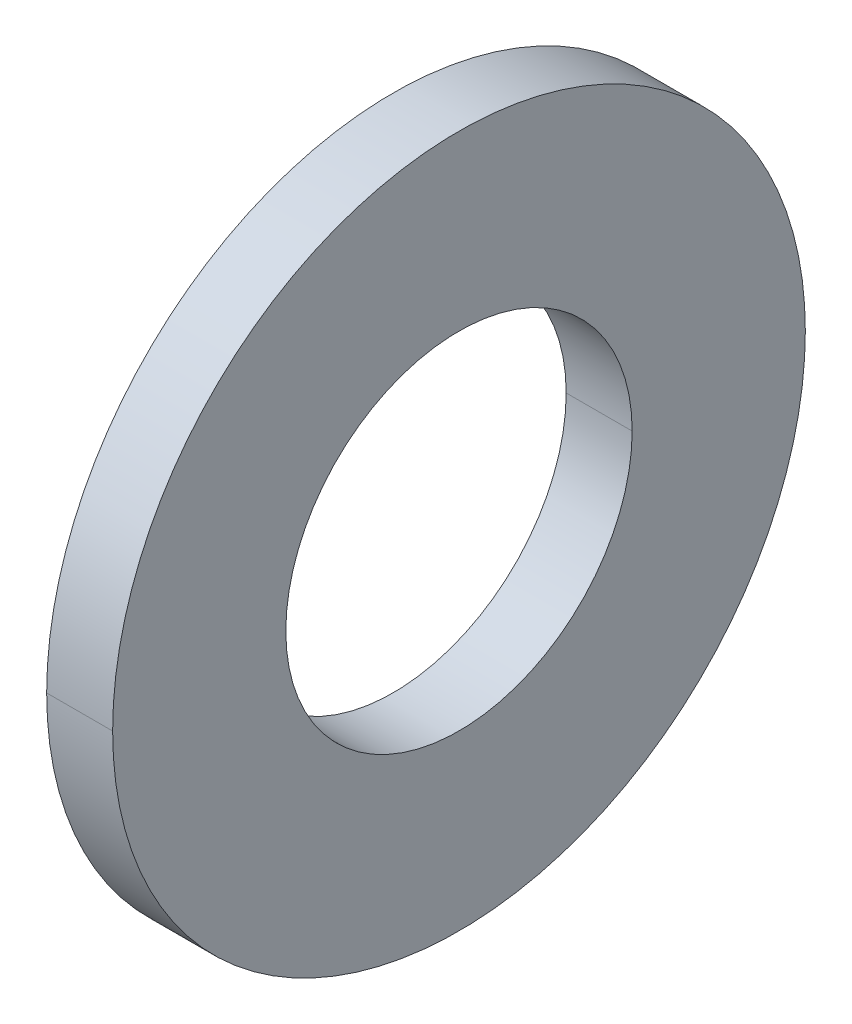
ISO-10303-21;
HEADER;
FILE_DESCRIPTION(('STEP AP214'),'2;1');
FILE_NAME('part.step','',(''),(''),'','','');
FILE_SCHEMA(('AUTOMOTIVE_DESIGN { 1 0 10303 214 1 1 1 1 }'));
ENDSEC;
DATA;
#1=APPLICATION_CONTEXT('core data for automotive mechanical design processes');
#2=APPLICATION_PROTOCOL_DEFINITION('international standard','automotive_design',2000,#1);
#3=PRODUCT_CONTEXT('',#1,'mechanical');
#4=PRODUCT('Part','Part','',(#3));
#5=PRODUCT_RELATED_PRODUCT_CATEGORY('part','',(#4));
#6=PRODUCT_DEFINITION_FORMATION('','',#4);
#7=PRODUCT_DEFINITION_CONTEXT('part definition',#1,'design');
#8=PRODUCT_DEFINITION('design','',#6,#7);
#9=PRODUCT_DEFINITION_SHAPE('','',#8);
#10=(LENGTH_UNIT() NAMED_UNIT(*) SI_UNIT(.MILLI.,.METRE.));
#11=(NAMED_UNIT(*) PLANE_ANGLE_UNIT() SI_UNIT($,.RADIAN.));
#12=(NAMED_UNIT(*) SI_UNIT($,.STERADIAN.) SOLID_ANGLE_UNIT());
#13=UNCERTAINTY_MEASURE_WITH_UNIT(LENGTH_MEASURE(1.E-05),#10,'distance_accuracy_value','');
#14=(GEOMETRIC_REPRESENTATION_CONTEXT(3) GLOBAL_UNCERTAINTY_ASSIGNED_CONTEXT((#13)) GLOBAL_UNIT_ASSIGNED_CONTEXT((#10,
#11,#12)) REPRESENTATION_CONTEXT('',''));
#15=CARTESIAN_POINT('',(0.,0.,0.));
#16=DIRECTION('',(0.,0.,1.));
#17=DIRECTION('',(1.,0.,0.));
#18=AXIS2_PLACEMENT_3D('',#15,#16,#17);
#19=CARTESIAN_POINT('',(1.,0.,0.));
#20=DIRECTION('',(-1.,0.,0.));
#21=DIRECTION('',(0.,1.,0.));
#22=AXIS2_PLACEMENT_3D('',#19,#20,#21);
#23=CYLINDRICAL_SURFACE('',#22,10.5);
#24=CARTESIAN_POINT('',(-1.,0.,0.));
#25=DIRECTION('',(1.,0.,0.));
#26=DIRECTION('',(0.,0.,-1.));
#27=AXIS2_PLACEMENT_3D('',#24,#25,#26);
#28=CIRCLE('',#27,10.5);
#29=CARTESIAN_POINT('',(-1.,0.,10.5));
#30=VERTEX_POINT('',#29);
#31=CARTESIAN_POINT('',(-1.,0.,-10.5));
#32=VERTEX_POINT('',#31);
#33=EDGE_CURVE('E10',#30,#32,#28,.T.);
#34=ORIENTED_EDGE('',*,*,#33,.T.);
#35=CARTESIAN_POINT('',(1.,0.,-10.5));
#36=DIRECTION('',(-1.,0.,0.));
#37=VECTOR('',#36,1.);
#38=LINE('',#35,#37);
#39=CARTESIAN_POINT('',(1.,0.,-10.5));
#40=VERTEX_POINT('',#39);
#41=EDGE_CURVE('E25',#40,#32,#38,.T.);
#42=ORIENTED_EDGE('',*,*,#41,.F.);
#43=CARTESIAN_POINT('',(1.,0.,0.));
#44=DIRECTION('',(1.,0.,0.));
#45=DIRECTION('',(0.,0.,-1.));
#46=AXIS2_PLACEMENT_3D('',#43,#44,#45);
#47=CIRCLE('',#46,10.5);
#48=CARTESIAN_POINT('',(1.,0.,10.5));
#49=VERTEX_POINT('',#48);
#50=EDGE_CURVE('E160',#49,#40,#47,.T.);
#51=ORIENTED_EDGE('',*,*,#50,.F.);
#52=CARTESIAN_POINT('',(1.,0.,10.5));
#53=DIRECTION('',(-1.,0.,0.));
#54=VECTOR('',#53,1.);
#55=LINE('',#52,#54);
#56=EDGE_CURVE('E148',#49,#30,#55,.T.);
#57=ORIENTED_EDGE('',*,*,#56,.T.);
#58=EDGE_LOOP('',(#34,#42,#51,#57));
#59=FACE_BOUND('',#58,.T.);
#60=ADVANCED_FACE('F16',(#59),#23,.T.);
#61=CARTESIAN_POINT('',(1.,0.,0.));
#62=DIRECTION('',(-1.,0.,0.));
#63=DIRECTION('',(0.,-1.,0.));
#64=AXIS2_PLACEMENT_3D('',#61,#62,#63);
#65=CYLINDRICAL_SURFACE('',#64,10.5);
#66=CARTESIAN_POINT('',(1.,0.,0.));
#67=DIRECTION('',(1.,0.,0.));
#68=DIRECTION('',(0.,0.,-1.));
#69=AXIS2_PLACEMENT_3D('',#66,#67,#68);
#70=CIRCLE('',#69,10.5);
#71=EDGE_CURVE('E145',#40,#49,#70,.T.);
#72=ORIENTED_EDGE('',*,*,#71,.F.);
#73=ORIENTED_EDGE('',*,*,#41,.T.);
#74=CARTESIAN_POINT('',(-1.,0.,0.));
#75=DIRECTION('',(1.,0.,0.));
#76=DIRECTION('',(0.,0.,-1.));
#77=AXIS2_PLACEMENT_3D('',#74,#75,#76);
#78=CIRCLE('',#77,10.5);
#79=EDGE_CURVE('E113',#32,#30,#78,.T.);
#80=ORIENTED_EDGE('',*,*,#79,.T.);
#81=ORIENTED_EDGE('',*,*,#56,.F.);
#82=EDGE_LOOP('',(#72,#73,#80,#81));
#83=FACE_BOUND('',#82,.T.);
#84=ADVANCED_FACE('F121',(#83),#65,.T.);
#85=CARTESIAN_POINT('',(-1.,10.5,0.));
#86=DIRECTION('',(-1.,0.,0.));
#87=DIRECTION('',(0.,0.,1.));
#88=AXIS2_PLACEMENT_3D('',#85,#86,#87);
#89=PLANE('',#88);
#90=CARTESIAN_POINT('',(-1.,0.,0.));
#91=DIRECTION('',(1.,0.,0.));
#92=DIRECTION('',(0.,0.,-1.));
#93=AXIS2_PLACEMENT_3D('',#90,#91,#92);
#94=CIRCLE('',#93,5.25);
#95=CARTESIAN_POINT('',(-1.,0.,-5.25));
#96=VERTEX_POINT('',#95);
#97=CARTESIAN_POINT('',(-1.,0.,5.25));
#98=VERTEX_POINT('',#97);
#99=EDGE_CURVE('E72',#96,#98,#94,.T.);
#100=ORIENTED_EDGE('',*,*,#99,.T.);
#101=CARTESIAN_POINT('',(-1.,0.,0.));
#102=DIRECTION('',(1.,0.,0.));
#103=DIRECTION('',(0.,0.,-1.));
#104=AXIS2_PLACEMENT_3D('',#101,#102,#103);
#105=CIRCLE('',#104,5.25);
#106=EDGE_CURVE('E108',#98,#96,#105,.T.);
#107=ORIENTED_EDGE('',*,*,#106,.T.);
#108=EDGE_LOOP('',(#100,#107));
#109=FACE_BOUND('',#108,.T.);
#110=ORIENTED_EDGE('',*,*,#79,.F.);
#111=ORIENTED_EDGE('',*,*,#33,.F.);
#112=EDGE_LOOP('',(#110,#111));
#113=FACE_BOUND('',#112,.T.);
#114=ADVANCED_FACE('F93',(#109,#113),#89,.T.);
#115=CARTESIAN_POINT('',(1.,0.,0.));
#116=DIRECTION('',(-1.,0.,0.));
#117=DIRECTION('',(0.,1.,0.));
#118=AXIS2_PLACEMENT_3D('',#115,#116,#117);
#119=CYLINDRICAL_SURFACE('',#118,5.25);
#120=ORIENTED_EDGE('',*,*,#106,.F.);
#121=CARTESIAN_POINT('',(1.,0.,5.25));
#122=DIRECTION('',(-1.,0.,0.));
#123=VECTOR('',#122,1.);
#124=LINE('',#121,#123);
#125=CARTESIAN_POINT('',(1.,0.,5.25));
#126=VERTEX_POINT('',#125);
#127=EDGE_CURVE('E62',#126,#98,#124,.T.);
#128=ORIENTED_EDGE('',*,*,#127,.F.);
#129=CARTESIAN_POINT('',(1.,0.,0.));
#130=DIRECTION('',(1.,0.,0.));
#131=DIRECTION('',(0.,0.,-1.));
#132=AXIS2_PLACEMENT_3D('',#129,#130,#131);
#133=CIRCLE('',#132,5.25);
#134=CARTESIAN_POINT('',(1.,0.,-5.25));
#135=VERTEX_POINT('',#134);
#136=EDGE_CURVE('E54',#126,#135,#133,.T.);
#137=ORIENTED_EDGE('',*,*,#136,.T.);
#138=CARTESIAN_POINT('',(1.,0.,-5.25));
#139=DIRECTION('',(-1.,0.,0.));
#140=VECTOR('',#139,1.);
#141=LINE('',#138,#140);
#142=EDGE_CURVE('E58',#135,#96,#141,.T.);
#143=ORIENTED_EDGE('',*,*,#142,.T.);
#144=EDGE_LOOP('',(#120,#128,#137,#143));
#145=FACE_BOUND('',#144,.T.);
#146=ADVANCED_FACE('F57',(#145),#119,.F.);
#147=CARTESIAN_POINT('',(1.,0.,0.));
#148=DIRECTION('',(-1.,0.,0.));
#149=DIRECTION('',(0.,-1.,0.));
#150=AXIS2_PLACEMENT_3D('',#147,#148,#149);
#151=CYLINDRICAL_SURFACE('',#150,5.25);
#152=CARTESIAN_POINT('',(1.,0.,0.));
#153=DIRECTION('',(1.,0.,0.));
#154=DIRECTION('',(0.,0.,-1.));
#155=AXIS2_PLACEMENT_3D('',#152,#153,#154);
#156=CIRCLE('',#155,5.25);
#157=EDGE_CURVE('E71',#135,#126,#156,.T.);
#158=ORIENTED_EDGE('',*,*,#157,.T.);
#159=ORIENTED_EDGE('',*,*,#127,.T.);
#160=ORIENTED_EDGE('',*,*,#99,.F.);
#161=ORIENTED_EDGE('',*,*,#142,.F.);
#162=EDGE_LOOP('',(#158,#159,#160,#161));
#163=FACE_BOUND('',#162,.T.);
#164=ADVANCED_FACE('F70',(#163),#151,.F.);
#165=CARTESIAN_POINT('',(1.,5.25,0.));
#166=DIRECTION('',(1.,0.,0.));
#167=DIRECTION('',(0.,0.,-1.));
#168=AXIS2_PLACEMENT_3D('',#165,#166,#167);
#169=PLANE('',#168);
#170=ORIENTED_EDGE('',*,*,#71,.T.);
#171=ORIENTED_EDGE('',*,*,#50,.T.);
#172=EDGE_LOOP('',(#170,#171));
#173=FACE_BOUND('',#172,.T.);
#174=ORIENTED_EDGE('',*,*,#157,.F.);
#175=ORIENTED_EDGE('',*,*,#136,.F.);
#176=EDGE_LOOP('',(#174,#175));
#177=FACE_BOUND('',#176,.T.);
#178=ADVANCED_FACE('F75',(#173,#177),#169,.T.);
#179=CLOSED_SHELL('',(#60,#84,#114,#146,#164,#178));
#180=MANIFOLD_SOLID_BREP('B1',#179);
#181=ADVANCED_BREP_SHAPE_REPRESENTATION('',(#18,#180),#14);
#182=SHAPE_DEFINITION_REPRESENTATION(#9,#181);
ENDSEC;
END-ISO-10303-21;
